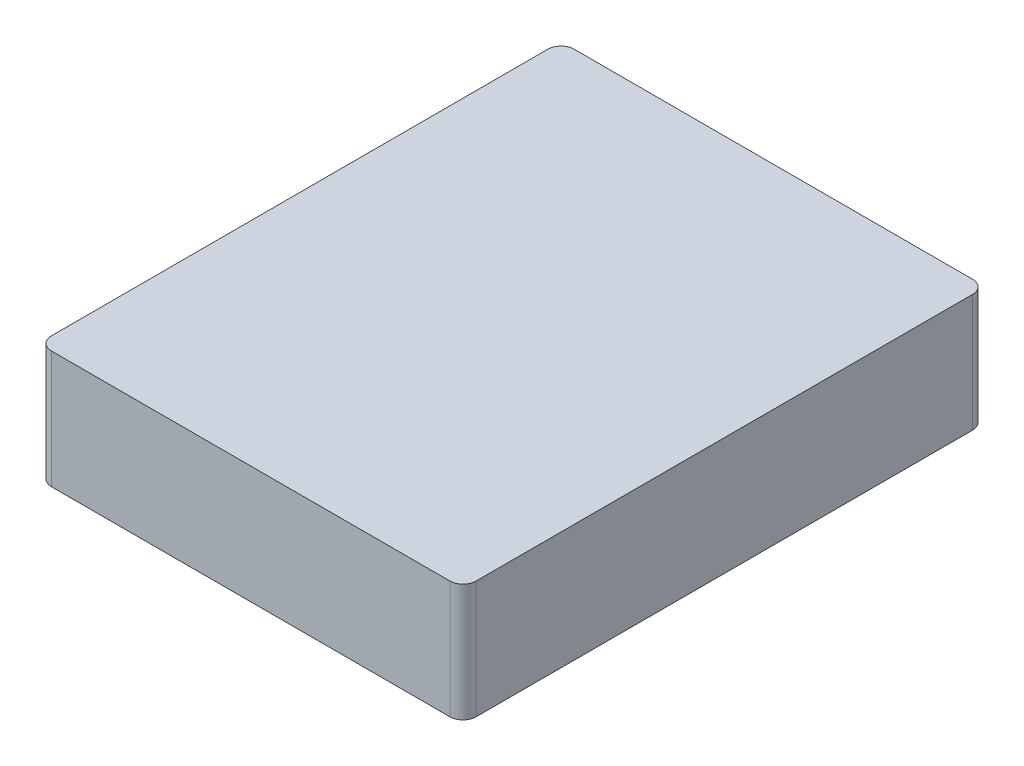
ISO-10303-21;
HEADER;
FILE_DESCRIPTION(('STEP AP214'),'2;1');
FILE_NAME('part.step','',(''),(''),'','','');
FILE_SCHEMA(('AUTOMOTIVE_DESIGN { 1 0 10303 214 1 1 1 1 }'));
ENDSEC;
DATA;
#1=APPLICATION_CONTEXT('core data for automotive mechanical design processes');
#2=APPLICATION_PROTOCOL_DEFINITION('international standard','automotive_design',2000,#1);
#3=PRODUCT_CONTEXT('',#1,'mechanical');
#4=PRODUCT('Part','Part','',(#3));
#5=PRODUCT_RELATED_PRODUCT_CATEGORY('part','',(#4));
#6=PRODUCT_DEFINITION_FORMATION('','',#4);
#7=PRODUCT_DEFINITION_CONTEXT('part definition',#1,'design');
#8=PRODUCT_DEFINITION('design','',#6,#7);
#9=PRODUCT_DEFINITION_SHAPE('','',#8);
#10=(LENGTH_UNIT() NAMED_UNIT(*) SI_UNIT(.MILLI.,.METRE.));
#11=(NAMED_UNIT(*) PLANE_ANGLE_UNIT() SI_UNIT($,.RADIAN.));
#12=(NAMED_UNIT(*) SI_UNIT($,.STERADIAN.) SOLID_ANGLE_UNIT());
#13=UNCERTAINTY_MEASURE_WITH_UNIT(LENGTH_MEASURE(1.E-05),#10,'distance_accuracy_value','');
#14=(GEOMETRIC_REPRESENTATION_CONTEXT(3) GLOBAL_UNCERTAINTY_ASSIGNED_CONTEXT((#13)) GLOBAL_UNIT_ASSIGNED_CONTEXT((#10,
#11,#12)) REPRESENTATION_CONTEXT('',''));
#15=CARTESIAN_POINT('',(0.,0.,0.));
#16=DIRECTION('',(0.,0.,1.));
#17=DIRECTION('',(1.,0.,0.));
#18=AXIS2_PLACEMENT_3D('',#15,#16,#17);
#19=CARTESIAN_POINT('',(32.5,18.,40.));
#20=DIRECTION('',(-1.,0.,0.));
#21=DIRECTION('',(0.,0.,1.));
#22=AXIS2_PLACEMENT_3D('',#19,#20,#21);
#23=PLANE('',#22);
#24=DIRECTION('',(0.,0.,-1.));
#25=VECTOR('',#24,1.);
#26=CARTESIAN_POINT('',(32.5,0.,40.));
#27=LINE('',#26,#25);
#28=CARTESIAN_POINT('',(32.5,0.,38.));
#29=VERTEX_POINT('',#28);
#30=CARTESIAN_POINT('',(32.5,0.,-38.));
#31=VERTEX_POINT('',#30);
#32=EDGE_CURVE('E129',#29,#31,#27,.T.);
#33=ORIENTED_EDGE('',*,*,#32,.T.);
#34=DIRECTION('',(0.,-1.,0.));
#35=VECTOR('',#34,1.);
#36=CARTESIAN_POINT('',(32.5,18.,-38.));
#37=LINE('',#36,#35);
#38=CARTESIAN_POINT('',(32.5,18.,-38.));
#39=VERTEX_POINT('',#38);
#40=EDGE_CURVE('E152',#31,#39,#37,.F.);
#41=ORIENTED_EDGE('',*,*,#40,.T.);
#42=DIRECTION('',(0.,0.,-1.));
#43=VECTOR('',#42,1.);
#44=CARTESIAN_POINT('',(32.5,18.,40.));
#45=LINE('',#44,#43);
#46=CARTESIAN_POINT('',(32.5,18.,38.));
#47=VERTEX_POINT('',#46);
#48=EDGE_CURVE('E127',#47,#39,#45,.T.);
#49=ORIENTED_EDGE('',*,*,#48,.F.);
#50=DIRECTION('',(0.,-1.,0.));
#51=VECTOR('',#50,1.);
#52=CARTESIAN_POINT('',(32.5,18.,38.));
#53=LINE('',#52,#51);
#54=EDGE_CURVE('E149',#47,#29,#53,.T.);
#55=ORIENTED_EDGE('',*,*,#54,.T.);
#56=EDGE_LOOP('',(#33,#41,#49,#55));
#57=FACE_BOUND('',#56,.T.);
#58=ADVANCED_FACE('F34',(#57),#23,.F.);
#59=CARTESIAN_POINT('',(-32.5,18.,-40.));
#60=DIRECTION('',(0.,0.,1.));
#61=DIRECTION('',(1.,0.,0.));
#62=AXIS2_PLACEMENT_3D('',#59,#60,#61);
#63=PLANE('',#62);
#64=DIRECTION('',(-1.,0.,0.));
#65=VECTOR('',#64,1.);
#66=CARTESIAN_POINT('',(-32.5,0.,-40.));
#67=LINE('',#66,#65);
#68=CARTESIAN_POINT('',(30.5,0.,-40.));
#69=VERTEX_POINT('',#68);
#70=CARTESIAN_POINT('',(-30.5,0.,-40.));
#71=VERTEX_POINT('',#70);
#72=EDGE_CURVE('E125',#69,#71,#67,.T.);
#73=ORIENTED_EDGE('',*,*,#72,.T.);
#74=DIRECTION('',(0.,-1.,0.));
#75=VECTOR('',#74,1.);
#76=CARTESIAN_POINT('',(-30.5,18.,-40.));
#77=LINE('',#76,#75);
#78=CARTESIAN_POINT('',(-30.5,18.,-40.));
#79=VERTEX_POINT('',#78);
#80=EDGE_CURVE('E104',#71,#79,#77,.F.);
#81=ORIENTED_EDGE('',*,*,#80,.T.);
#82=DIRECTION('',(-1.,0.,0.));
#83=VECTOR('',#82,1.);
#84=CARTESIAN_POINT('',(-32.5,18.,-40.));
#85=LINE('',#84,#83);
#86=CARTESIAN_POINT('',(30.5,18.,-40.));
#87=VERTEX_POINT('',#86);
#88=EDGE_CURVE('E168',#87,#79,#85,.T.);
#89=ORIENTED_EDGE('',*,*,#88,.F.);
#90=DIRECTION('',(0.,-1.,0.));
#91=VECTOR('',#90,1.);
#92=CARTESIAN_POINT('',(30.5,18.,-40.));
#93=LINE('',#92,#91);
#94=EDGE_CURVE('E109',#87,#69,#93,.T.);
#95=ORIENTED_EDGE('',*,*,#94,.T.);
#96=EDGE_LOOP('',(#73,#81,#89,#95));
#97=FACE_BOUND('',#96,.T.);
#98=ADVANCED_FACE('F185',(#97),#63,.F.);
#99=CARTESIAN_POINT('',(-32.5,18.,40.));
#100=DIRECTION('',(1.,0.,0.));
#101=DIRECTION('',(0.,0.,-1.));
#102=AXIS2_PLACEMENT_3D('',#99,#100,#101);
#103=PLANE('',#102);
#104=DIRECTION('',(0.,0.,1.));
#105=VECTOR('',#104,1.);
#106=CARTESIAN_POINT('',(-32.5,18.,40.));
#107=LINE('',#106,#105);
#108=CARTESIAN_POINT('',(-32.5,18.,-38.));
#109=VERTEX_POINT('',#108);
#110=CARTESIAN_POINT('',(-32.5,18.,38.));
#111=VERTEX_POINT('',#110);
#112=EDGE_CURVE('E118',#109,#111,#107,.T.);
#113=ORIENTED_EDGE('',*,*,#112,.F.);
#114=DIRECTION('',(0.,-1.,0.));
#115=VECTOR('',#114,1.);
#116=CARTESIAN_POINT('',(-32.5,18.,-38.));
#117=LINE('',#116,#115);
#118=CARTESIAN_POINT('',(-32.5,0.,-38.));
#119=VERTEX_POINT('',#118);
#120=EDGE_CURVE('E103',#109,#119,#117,.T.);
#121=ORIENTED_EDGE('',*,*,#120,.T.);
#122=DIRECTION('',(0.,0.,1.));
#123=VECTOR('',#122,1.);
#124=CARTESIAN_POINT('',(-32.5,0.,40.));
#125=LINE('',#124,#123);
#126=CARTESIAN_POINT('',(-32.5,0.,38.));
#127=VERTEX_POINT('',#126);
#128=EDGE_CURVE('E116',#119,#127,#125,.T.);
#129=ORIENTED_EDGE('',*,*,#128,.T.);
#130=DIRECTION('',(0.,-1.,0.));
#131=VECTOR('',#130,1.);
#132=CARTESIAN_POINT('',(-32.5,18.,38.));
#133=LINE('',#132,#131);
#134=EDGE_CURVE('E120',#127,#111,#133,.F.);
#135=ORIENTED_EDGE('',*,*,#134,.T.);
#136=EDGE_LOOP('',(#113,#121,#129,#135));
#137=FACE_BOUND('',#136,.T.);
#138=ADVANCED_FACE('F115',(#137),#103,.F.);
#139=CARTESIAN_POINT('',(-32.5,18.,40.));
#140=DIRECTION('',(0.,0.,-1.));
#141=DIRECTION('',(-1.,0.,0.));
#142=AXIS2_PLACEMENT_3D('',#139,#140,#141);
#143=PLANE('',#142);
#144=DIRECTION('',(1.,0.,0.));
#145=VECTOR('',#144,1.);
#146=CARTESIAN_POINT('',(-32.5,0.,40.));
#147=LINE('',#146,#145);
#148=CARTESIAN_POINT('',(-30.5,0.,40.));
#149=VERTEX_POINT('',#148);
#150=CARTESIAN_POINT('',(30.5,0.,40.));
#151=VERTEX_POINT('',#150);
#152=EDGE_CURVE('E124',#149,#151,#147,.T.);
#153=ORIENTED_EDGE('',*,*,#152,.T.);
#154=DIRECTION('',(0.,-1.,0.));
#155=VECTOR('',#154,1.);
#156=CARTESIAN_POINT('',(30.5,18.,40.));
#157=LINE('',#156,#155);
#158=CARTESIAN_POINT('',(30.5,18.,40.));
#159=VERTEX_POINT('',#158);
#160=EDGE_CURVE('E11',#151,#159,#157,.F.);
#161=ORIENTED_EDGE('',*,*,#160,.T.);
#162=DIRECTION('',(1.,0.,0.));
#163=VECTOR('',#162,1.);
#164=CARTESIAN_POINT('',(-32.5,18.,40.));
#165=LINE('',#164,#163);
#166=CARTESIAN_POINT('',(-30.5,18.,40.));
#167=VERTEX_POINT('',#166);
#168=EDGE_CURVE('E133',#167,#159,#165,.T.);
#169=ORIENTED_EDGE('',*,*,#168,.F.);
#170=DIRECTION('',(0.,-1.,0.));
#171=VECTOR('',#170,1.);
#172=CARTESIAN_POINT('',(-30.5,18.,40.));
#173=LINE('',#172,#171);
#174=EDGE_CURVE('E42',#167,#149,#173,.T.);
#175=ORIENTED_EDGE('',*,*,#174,.T.);
#176=EDGE_LOOP('',(#153,#161,#169,#175));
#177=FACE_BOUND('',#176,.T.);
#178=ADVANCED_FACE('F155',(#177),#143,.F.);
#179=CARTESIAN_POINT('',(0.,18.,0.));
#180=DIRECTION('',(0.,-1.,0.));
#181=DIRECTION('',(0.,0.,-1.));
#182=AXIS2_PLACEMENT_3D('',#179,#180,#181);
#183=PLANE('',#182);
#184=ORIENTED_EDGE('',*,*,#88,.T.);
#185=CARTESIAN_POINT('',(-30.5,18.,-38.));
#186=DIRECTION('',(0.,-1.,0.));
#187=DIRECTION('',(0.,0.,-1.));
#188=AXIS2_PLACEMENT_3D('',#185,#186,#187);
#189=CIRCLE('',#188,2.);
#190=EDGE_CURVE('E147',#79,#109,#189,.F.);
#191=ORIENTED_EDGE('',*,*,#190,.T.);
#192=ORIENTED_EDGE('',*,*,#112,.T.);
#193=CARTESIAN_POINT('',(-30.5,18.,38.));
#194=DIRECTION('',(0.,-1.,0.));
#195=DIRECTION('',(0.,0.,-1.));
#196=AXIS2_PLACEMENT_3D('',#193,#194,#195);
#197=CIRCLE('',#196,2.);
#198=EDGE_CURVE('E54',#111,#167,#197,.F.);
#199=ORIENTED_EDGE('',*,*,#198,.T.);
#200=ORIENTED_EDGE('',*,*,#168,.T.);
#201=CARTESIAN_POINT('',(30.5,18.,38.));
#202=DIRECTION('',(0.,-1.,0.));
#203=DIRECTION('',(0.,0.,-1.));
#204=AXIS2_PLACEMENT_3D('',#201,#202,#203);
#205=CIRCLE('',#204,2.);
#206=EDGE_CURVE('E143',#159,#47,#205,.F.);
#207=ORIENTED_EDGE('',*,*,#206,.T.);
#208=ORIENTED_EDGE('',*,*,#48,.T.);
#209=CARTESIAN_POINT('',(30.5,18.,-38.));
#210=DIRECTION('',(0.,-1.,0.));
#211=DIRECTION('',(0.,0.,-1.));
#212=AXIS2_PLACEMENT_3D('',#209,#210,#211);
#213=CIRCLE('',#212,2.);
#214=EDGE_CURVE('E145',#39,#87,#213,.F.);
#215=ORIENTED_EDGE('',*,*,#214,.T.);
#216=EDGE_LOOP('',(#184,#191,#192,#199,#200,#207,#208,#215));
#217=FACE_BOUND('',#216,.T.);
#218=ADVANCED_FACE('F174',(#217),#183,.F.);
#219=CARTESIAN_POINT('',(0.,0.,0.));
#220=DIRECTION('',(0.,-1.,0.));
#221=DIRECTION('',(0.,0.,-1.));
#222=AXIS2_PLACEMENT_3D('',#219,#220,#221);
#223=PLANE('',#222);
#224=ORIENTED_EDGE('',*,*,#128,.F.);
#225=CARTESIAN_POINT('',(-30.5,0.,-38.));
#226=DIRECTION('',(0.,-1.,0.));
#227=DIRECTION('',(0.,0.,-1.));
#228=AXIS2_PLACEMENT_3D('',#225,#226,#227);
#229=CIRCLE('',#228,2.);
#230=EDGE_CURVE('E99',#119,#71,#229,.T.);
#231=ORIENTED_EDGE('',*,*,#230,.T.);
#232=ORIENTED_EDGE('',*,*,#72,.F.);
#233=CARTESIAN_POINT('',(30.5,0.,-38.));
#234=DIRECTION('',(0.,-1.,0.));
#235=DIRECTION('',(0.,0.,-1.));
#236=AXIS2_PLACEMENT_3D('',#233,#234,#235);
#237=CIRCLE('',#236,2.);
#238=EDGE_CURVE('E110',#69,#31,#237,.T.);
#239=ORIENTED_EDGE('',*,*,#238,.T.);
#240=ORIENTED_EDGE('',*,*,#32,.F.);
#241=CARTESIAN_POINT('',(30.5,0.,38.));
#242=DIRECTION('',(0.,-1.,0.));
#243=DIRECTION('',(0.,0.,-1.));
#244=AXIS2_PLACEMENT_3D('',#241,#242,#243);
#245=CIRCLE('',#244,2.);
#246=EDGE_CURVE('E136',#29,#151,#245,.T.);
#247=ORIENTED_EDGE('',*,*,#246,.T.);
#248=ORIENTED_EDGE('',*,*,#152,.F.);
#249=CARTESIAN_POINT('',(-30.5,0.,38.));
#250=DIRECTION('',(0.,-1.,0.));
#251=DIRECTION('',(0.,0.,-1.));
#252=AXIS2_PLACEMENT_3D('',#249,#250,#251);
#253=CIRCLE('',#252,2.);
#254=EDGE_CURVE('E119',#149,#127,#253,.T.);
#255=ORIENTED_EDGE('',*,*,#254,.T.);
#256=EDGE_LOOP('',(#224,#231,#232,#239,#240,#247,#248,#255));
#257=FACE_BOUND('',#256,.T.);
#258=ADVANCED_FACE('F122',(#257),#223,.T.);
#259=CARTESIAN_POINT('',(-30.5,18.,-38.));
#260=DIRECTION('',(0.,-1.,0.));
#261=DIRECTION('',(0.,0.,-1.));
#262=AXIS2_PLACEMENT_3D('',#259,#260,#261);
#263=CYLINDRICAL_SURFACE('',#262,2.);
#264=ORIENTED_EDGE('',*,*,#190,.F.);
#265=ORIENTED_EDGE('',*,*,#80,.F.);
#266=ORIENTED_EDGE('',*,*,#230,.F.);
#267=ORIENTED_EDGE('',*,*,#120,.F.);
#268=EDGE_LOOP('',(#264,#265,#266,#267));
#269=FACE_BOUND('',#268,.T.);
#270=ADVANCED_FACE('F102',(#269),#263,.T.);
#271=CARTESIAN_POINT('',(30.5,18.,-38.));
#272=DIRECTION('',(0.,-1.,0.));
#273=DIRECTION('',(0.,0.,-1.));
#274=AXIS2_PLACEMENT_3D('',#271,#272,#273);
#275=CYLINDRICAL_SURFACE('',#274,2.);
#276=ORIENTED_EDGE('',*,*,#214,.F.);
#277=ORIENTED_EDGE('',*,*,#40,.F.);
#278=ORIENTED_EDGE('',*,*,#238,.F.);
#279=ORIENTED_EDGE('',*,*,#94,.F.);
#280=EDGE_LOOP('',(#276,#277,#278,#279));
#281=FACE_BOUND('',#280,.T.);
#282=ADVANCED_FACE('F196',(#281),#275,.T.);
#283=CARTESIAN_POINT('',(30.5,18.,38.));
#284=DIRECTION('',(0.,-1.,0.));
#285=DIRECTION('',(0.,0.,-1.));
#286=AXIS2_PLACEMENT_3D('',#283,#284,#285);
#287=CYLINDRICAL_SURFACE('',#286,2.);
#288=ORIENTED_EDGE('',*,*,#206,.F.);
#289=ORIENTED_EDGE('',*,*,#160,.F.);
#290=ORIENTED_EDGE('',*,*,#246,.F.);
#291=ORIENTED_EDGE('',*,*,#54,.F.);
#292=EDGE_LOOP('',(#288,#289,#290,#291));
#293=FACE_BOUND('',#292,.T.);
#294=ADVANCED_FACE('F162',(#293),#287,.T.);
#295=CARTESIAN_POINT('',(-30.5,18.,38.));
#296=DIRECTION('',(0.,-1.,0.));
#297=DIRECTION('',(0.,0.,-1.));
#298=AXIS2_PLACEMENT_3D('',#295,#296,#297);
#299=CYLINDRICAL_SURFACE('',#298,2.);
#300=ORIENTED_EDGE('',*,*,#198,.F.);
#301=ORIENTED_EDGE('',*,*,#134,.F.);
#302=ORIENTED_EDGE('',*,*,#254,.F.);
#303=ORIENTED_EDGE('',*,*,#174,.F.);
#304=EDGE_LOOP('',(#300,#301,#302,#303));
#305=FACE_BOUND('',#304,.T.);
#306=ADVANCED_FACE('F36',(#305),#299,.T.);
#307=CLOSED_SHELL('',(#58,#98,#138,#178,#218,#258,#270,#282,#294,#306));
#308=MANIFOLD_SOLID_BREP('B2',#307);
#309=ADVANCED_BREP_SHAPE_REPRESENTATION('',(#18,#308),#14);
#310=SHAPE_DEFINITION_REPRESENTATION(#9,#309);
ENDSEC;
END-ISO-10303-21;
